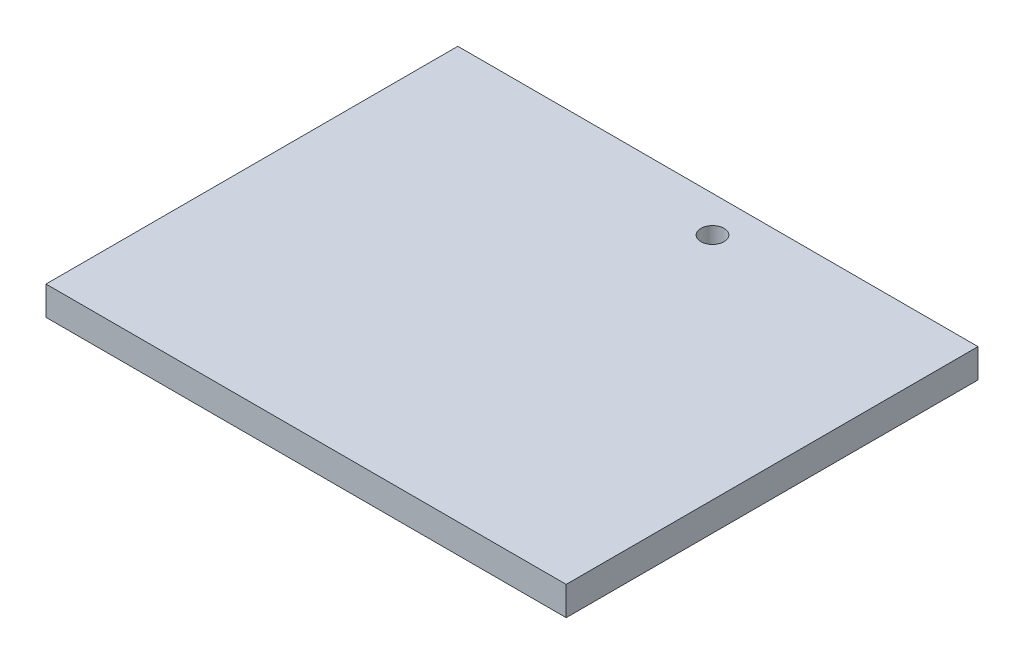
ISO-10303-21;
HEADER;
FILE_DESCRIPTION(('STEP AP214'),'2;1');
FILE_NAME('part.step','',(''),(''),'','','');
FILE_SCHEMA(('AUTOMOTIVE_DESIGN { 1 0 10303 214 1 1 1 1 }'));
ENDSEC;
DATA;
#1=APPLICATION_CONTEXT('core data for automotive mechanical design processes');
#2=APPLICATION_PROTOCOL_DEFINITION('international standard','automotive_design',2000,#1);
#3=PRODUCT_CONTEXT('',#1,'mechanical');
#4=PRODUCT('Part','Part','',(#3));
#5=PRODUCT_RELATED_PRODUCT_CATEGORY('part','',(#4));
#6=PRODUCT_DEFINITION_FORMATION('','',#4);
#7=PRODUCT_DEFINITION_CONTEXT('part definition',#1,'design');
#8=PRODUCT_DEFINITION('design','',#6,#7);
#9=PRODUCT_DEFINITION_SHAPE('','',#8);
#10=(LENGTH_UNIT() NAMED_UNIT(*) SI_UNIT(.MILLI.,.METRE.));
#11=(NAMED_UNIT(*) PLANE_ANGLE_UNIT() SI_UNIT($,.RADIAN.));
#12=(NAMED_UNIT(*) SI_UNIT($,.STERADIAN.) SOLID_ANGLE_UNIT());
#13=UNCERTAINTY_MEASURE_WITH_UNIT(LENGTH_MEASURE(1.E-05),#10,'distance_accuracy_value','');
#14=(GEOMETRIC_REPRESENTATION_CONTEXT(3) GLOBAL_UNCERTAINTY_ASSIGNED_CONTEXT((#13)) GLOBAL_UNIT_ASSIGNED_CONTEXT((#10,
#11,#12)) REPRESENTATION_CONTEXT('',''));
#15=CARTESIAN_POINT('',(0.,0.,0.));
#16=DIRECTION('',(0.,0.,1.));
#17=DIRECTION('',(1.,0.,0.));
#18=AXIS2_PLACEMENT_3D('',#15,#16,#17);
#19=CARTESIAN_POINT('',(36.,4.,0.));
#20=DIRECTION('',(1.,0.,0.));
#21=DIRECTION('',(0.,0.,-1.));
#22=AXIS2_PLACEMENT_3D('',#19,#20,#21);
#23=PLANE('',#22);
#24=DIRECTION('',(0.,0.,1.));
#25=VECTOR('',#24,1.);
#26=CARTESIAN_POINT('',(36.,0.,0.));
#27=LINE('',#26,#25);
#28=CARTESIAN_POINT('',(36.,0.,-28.5));
#29=VERTEX_POINT('',#28);
#30=CARTESIAN_POINT('',(36.,0.,28.5));
#31=VERTEX_POINT('',#30);
#32=EDGE_CURVE('E121',#29,#31,#27,.T.);
#33=ORIENTED_EDGE('',*,*,#32,.F.);
#34=DIRECTION('',(0.,-1.,0.));
#35=VECTOR('',#34,1.);
#36=CARTESIAN_POINT('',(36.,4.,-28.5));
#37=LINE('',#36,#35);
#38=CARTESIAN_POINT('',(36.,4.,-28.5));
#39=VERTEX_POINT('',#38);
#40=EDGE_CURVE('E11',#39,#29,#37,.T.);
#41=ORIENTED_EDGE('',*,*,#40,.F.);
#42=DIRECTION('',(0.,0.,1.));
#43=VECTOR('',#42,1.);
#44=CARTESIAN_POINT('',(36.,4.,0.));
#45=LINE('',#44,#43);
#46=CARTESIAN_POINT('',(36.,4.,28.5));
#47=VERTEX_POINT('',#46);
#48=EDGE_CURVE('E100',#39,#47,#45,.T.);
#49=ORIENTED_EDGE('',*,*,#48,.T.);
#50=DIRECTION('',(0.,-1.,0.));
#51=VECTOR('',#50,1.);
#52=CARTESIAN_POINT('',(36.,4.,28.5));
#53=LINE('',#52,#51);
#54=EDGE_CURVE('E81',#47,#31,#53,.T.);
#55=ORIENTED_EDGE('',*,*,#54,.T.);
#56=EDGE_LOOP('',(#33,#41,#49,#55));
#57=FACE_BOUND('',#56,.T.);
#58=ADVANCED_FACE('F41',(#57),#23,.T.);
#59=CARTESIAN_POINT('',(0.,4.,-28.5));
#60=DIRECTION('',(0.,0.,1.));
#61=DIRECTION('',(1.,0.,0.));
#62=AXIS2_PLACEMENT_3D('',#59,#60,#61);
#63=PLANE('',#62);
#64=DIRECTION('',(-1.,0.,0.));
#65=VECTOR('',#64,1.);
#66=CARTESIAN_POINT('',(0.,0.,-28.5));
#67=LINE('',#66,#65);
#68=CARTESIAN_POINT('',(-36.,0.,-28.5));
#69=VERTEX_POINT('',#68);
#70=EDGE_CURVE('E106',#29,#69,#67,.T.);
#71=ORIENTED_EDGE('',*,*,#70,.T.);
#72=DIRECTION('',(0.,-1.,0.));
#73=VECTOR('',#72,1.);
#74=CARTESIAN_POINT('',(-36.,4.,-28.5));
#75=LINE('',#74,#73);
#76=CARTESIAN_POINT('',(-36.,4.,-28.5));
#77=VERTEX_POINT('',#76);
#78=EDGE_CURVE('E51',#77,#69,#75,.T.);
#79=ORIENTED_EDGE('',*,*,#78,.F.);
#80=DIRECTION('',(-1.,0.,0.));
#81=VECTOR('',#80,1.);
#82=CARTESIAN_POINT('',(0.,4.,-28.5));
#83=LINE('',#82,#81);
#84=EDGE_CURVE('E97',#39,#77,#83,.T.);
#85=ORIENTED_EDGE('',*,*,#84,.F.);
#86=ORIENTED_EDGE('',*,*,#40,.T.);
#87=EDGE_LOOP('',(#71,#79,#85,#86));
#88=FACE_BOUND('',#87,.T.);
#89=ADVANCED_FACE('F104',(#88),#63,.F.);
#90=CARTESIAN_POINT('',(-36.,4.,0.));
#91=DIRECTION('',(1.,0.,0.));
#92=DIRECTION('',(0.,0.,-1.));
#93=AXIS2_PLACEMENT_3D('',#90,#91,#92);
#94=PLANE('',#93);
#95=DIRECTION('',(0.,0.,1.));
#96=VECTOR('',#95,1.);
#97=CARTESIAN_POINT('',(-36.,0.,0.));
#98=LINE('',#97,#96);
#99=CARTESIAN_POINT('',(-36.,0.,28.5));
#100=VERTEX_POINT('',#99);
#101=EDGE_CURVE('E116',#69,#100,#98,.T.);
#102=ORIENTED_EDGE('',*,*,#101,.T.);
#103=DIRECTION('',(0.,-1.,0.));
#104=VECTOR('',#103,1.);
#105=CARTESIAN_POINT('',(-36.,4.,28.5));
#106=LINE('',#105,#104);
#107=CARTESIAN_POINT('',(-36.,4.,28.5));
#108=VERTEX_POINT('',#107);
#109=EDGE_CURVE('E95',#108,#100,#106,.T.);
#110=ORIENTED_EDGE('',*,*,#109,.F.);
#111=DIRECTION('',(0.,0.,1.));
#112=VECTOR('',#111,1.);
#113=CARTESIAN_POINT('',(-36.,4.,0.));
#114=LINE('',#113,#112);
#115=EDGE_CURVE('E89',#77,#108,#114,.T.);
#116=ORIENTED_EDGE('',*,*,#115,.F.);
#117=ORIENTED_EDGE('',*,*,#78,.T.);
#118=EDGE_LOOP('',(#102,#110,#116,#117));
#119=FACE_BOUND('',#118,.T.);
#120=ADVANCED_FACE('F92',(#119),#94,.F.);
#121=CARTESIAN_POINT('',(4.25,4.,-23.5));
#122=DIRECTION('',(0.,-1.,0.));
#123=DIRECTION('',(0.,0.,-1.));
#124=AXIS2_PLACEMENT_3D('',#121,#122,#123);
#125=CYLINDRICAL_SURFACE('',#124,1.6);
#126=CARTESIAN_POINT('',(4.25,4.,-23.5));
#127=DIRECTION('',(0.,1.,0.));
#128=DIRECTION('',(0.,0.,1.));
#129=AXIS2_PLACEMENT_3D('',#126,#127,#128);
#130=CIRCLE('',#129,1.6);
#131=CARTESIAN_POINT('',(4.25,4.,-21.9));
#132=VERTEX_POINT('',#131);
#133=EDGE_CURVE('E115',#132,#132,#130,.T.);
#134=ORIENTED_EDGE('',*,*,#133,.T.);
#135=EDGE_LOOP('',(#134));
#136=FACE_BOUND('',#135,.T.);
#137=CARTESIAN_POINT('',(4.25,0.,-23.5));
#138=DIRECTION('',(0.,1.,0.));
#139=DIRECTION('',(0.,0.,1.));
#140=AXIS2_PLACEMENT_3D('',#137,#138,#139);
#141=CIRCLE('',#140,1.6);
#142=CARTESIAN_POINT('',(4.25,0.,-21.9));
#143=VERTEX_POINT('',#142);
#144=EDGE_CURVE('E124',#143,#143,#141,.T.);
#145=ORIENTED_EDGE('',*,*,#144,.F.);
#146=EDGE_LOOP('',(#145));
#147=FACE_BOUND('',#146,.T.);
#148=ADVANCED_FACE('F43',(#136,#147),#125,.F.);
#149=CARTESIAN_POINT('',(0.,4.,28.5));
#150=DIRECTION('',(0.,0.,-1.));
#151=DIRECTION('',(-1.,0.,0.));
#152=AXIS2_PLACEMENT_3D('',#149,#150,#151);
#153=PLANE('',#152);
#154=DIRECTION('',(1.,0.,0.));
#155=VECTOR('',#154,1.);
#156=CARTESIAN_POINT('',(0.,0.,28.5));
#157=LINE('',#156,#155);
#158=EDGE_CURVE('E74',#100,#31,#157,.T.);
#159=ORIENTED_EDGE('',*,*,#158,.T.);
#160=ORIENTED_EDGE('',*,*,#54,.F.);
#161=DIRECTION('',(1.,0.,0.));
#162=VECTOR('',#161,1.);
#163=CARTESIAN_POINT('',(0.,4.,28.5));
#164=LINE('',#163,#162);
#165=EDGE_CURVE('E59',#108,#47,#164,.T.);
#166=ORIENTED_EDGE('',*,*,#165,.F.);
#167=ORIENTED_EDGE('',*,*,#109,.T.);
#168=EDGE_LOOP('',(#159,#160,#166,#167));
#169=FACE_BOUND('',#168,.T.);
#170=ADVANCED_FACE('F140',(#169),#153,.F.);
#171=CARTESIAN_POINT('',(0.,4.,0.));
#172=DIRECTION('',(0.,1.,0.));
#173=DIRECTION('',(0.,0.,1.));
#174=AXIS2_PLACEMENT_3D('',#171,#172,#173);
#175=PLANE('',#174);
#176=ORIENTED_EDGE('',*,*,#133,.F.);
#177=EDGE_LOOP('',(#176));
#178=FACE_BOUND('',#177,.T.);
#179=ORIENTED_EDGE('',*,*,#48,.F.);
#180=ORIENTED_EDGE('',*,*,#84,.T.);
#181=ORIENTED_EDGE('',*,*,#115,.T.);
#182=ORIENTED_EDGE('',*,*,#165,.T.);
#183=EDGE_LOOP('',(#179,#180,#181,#182));
#184=FACE_BOUND('',#183,.T.);
#185=ADVANCED_FACE('F99',(#178,#184),#175,.T.);
#186=CARTESIAN_POINT('',(0.,0.,0.));
#187=DIRECTION('',(0.,1.,0.));
#188=DIRECTION('',(0.,0.,1.));
#189=AXIS2_PLACEMENT_3D('',#186,#187,#188);
#190=PLANE('',#189);
#191=ORIENTED_EDGE('',*,*,#144,.T.);
#192=EDGE_LOOP('',(#191));
#193=FACE_BOUND('',#192,.T.);
#194=ORIENTED_EDGE('',*,*,#32,.T.);
#195=ORIENTED_EDGE('',*,*,#158,.F.);
#196=ORIENTED_EDGE('',*,*,#101,.F.);
#197=ORIENTED_EDGE('',*,*,#70,.F.);
#198=EDGE_LOOP('',(#194,#195,#196,#197));
#199=FACE_BOUND('',#198,.T.);
#200=ADVANCED_FACE('F139',(#193,#199),#190,.F.);
#201=CLOSED_SHELL('',(#58,#89,#120,#148,#170,#185,#200));
#202=MANIFOLD_SOLID_BREP('B2',#201);
#203=ADVANCED_BREP_SHAPE_REPRESENTATION('',(#18,#202),#14);
#204=SHAPE_DEFINITION_REPRESENTATION(#9,#203);
ENDSEC;
END-ISO-10303-21;
